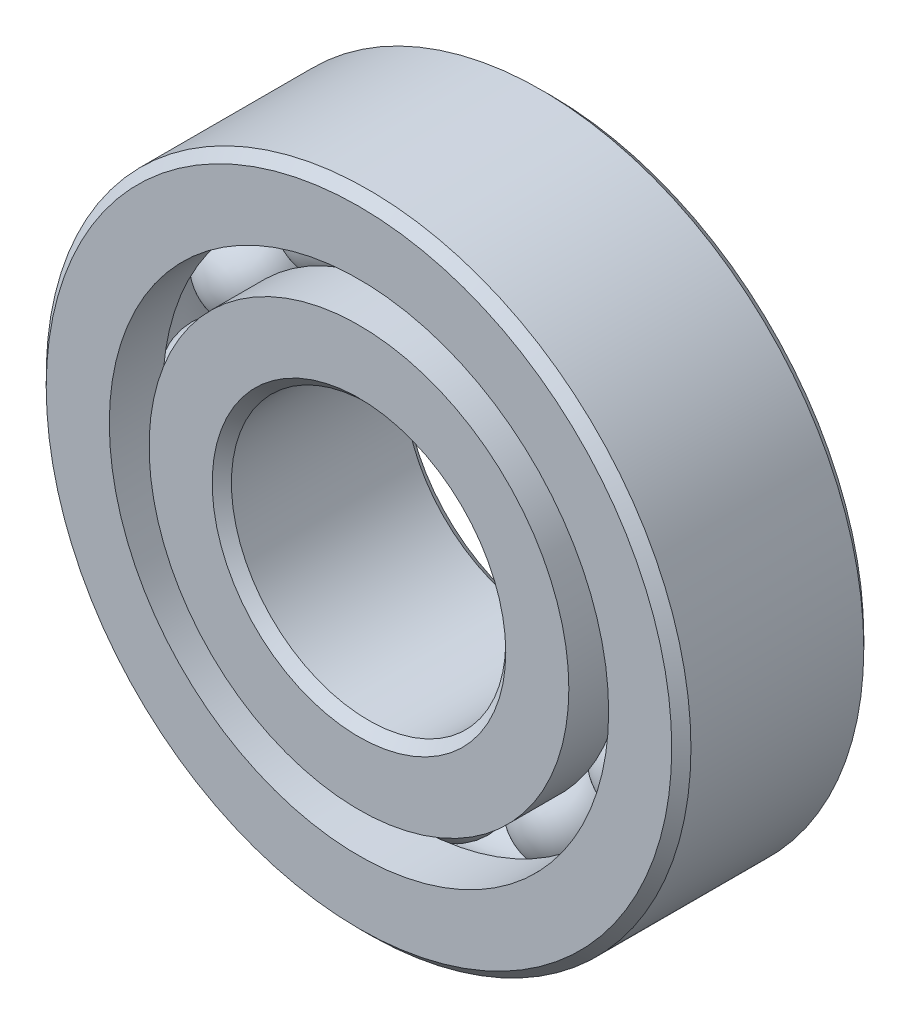
ISO-10303-21;
HEADER;
FILE_DESCRIPTION(('STEP AP214'),'2;1');
FILE_NAME('part.step','',(''),(''),'','','');
FILE_SCHEMA(('AUTOMOTIVE_DESIGN { 1 0 10303 214 1 1 1 1 }'));
ENDSEC;
DATA;
#1=APPLICATION_CONTEXT('core data for automotive mechanical design processes');
#2=APPLICATION_PROTOCOL_DEFINITION('international standard','automotive_design',2000,#1);
#3=PRODUCT_CONTEXT('',#1,'mechanical');
#4=PRODUCT('Part','Part','',(#3));
#5=PRODUCT_RELATED_PRODUCT_CATEGORY('part','',(#4));
#6=PRODUCT_DEFINITION_FORMATION('','',#4);
#7=PRODUCT_DEFINITION_CONTEXT('part definition',#1,'design');
#8=PRODUCT_DEFINITION('design','',#6,#7);
#9=PRODUCT_DEFINITION_SHAPE('','',#8);
#10=(LENGTH_UNIT() NAMED_UNIT(*) SI_UNIT(.MILLI.,.METRE.));
#11=(NAMED_UNIT(*) PLANE_ANGLE_UNIT() SI_UNIT($,.RADIAN.));
#12=(NAMED_UNIT(*) SI_UNIT($,.STERADIAN.) SOLID_ANGLE_UNIT());
#13=UNCERTAINTY_MEASURE_WITH_UNIT(LENGTH_MEASURE(1.E-05),#10,'distance_accuracy_value','');
#14=(GEOMETRIC_REPRESENTATION_CONTEXT(3) GLOBAL_UNCERTAINTY_ASSIGNED_CONTEXT((#13)) GLOBAL_UNIT_ASSIGNED_CONTEXT((#10,
#11,#12)) REPRESENTATION_CONTEXT('',''));
#15=CARTESIAN_POINT('',(0.,0.,0.));
#16=DIRECTION('',(0.,0.,1.));
#17=DIRECTION('',(1.,0.,0.));
#18=AXIS2_PLACEMENT_3D('',#15,#16,#17);
#19=CARTESIAN_POINT('',(-8.37499999999982,14.5059255133895,0.));
#20=DIRECTION('',(0.,0.,1.));
#21=DIRECTION('',(-0.499999999999989,0.866025403784445,0.));
#22=AXIS2_PLACEMENT_3D('',#19,#20,#21);
#23=SPHERICAL_SURFACE('',#22,3.43265291781274);
#24=CARTESIAN_POINT('',(-8.37499999999982,14.5059255133895,3.43265291781274));
#25=VERTEX_POINT('',#24);
#26=VERTEX_LOOP('',#25);
#27=FACE_BOUND('',#26,.T.);
#28=ADVANCED_FACE('F38',(#27),#23,.T.);
#29=CLOSED_SHELL('',(#28));
#30=MANIFOLD_SOLID_BREP('B2',#29);
#31=CARTESIAN_POINT('',(-14.5059255133893,8.37500000000017,0.));
#32=DIRECTION('',(0.,0.,1.));
#33=DIRECTION('',(-0.866025403784433,0.50000000000001,0.));
#34=AXIS2_PLACEMENT_3D('',#31,#32,#33);
#35=SPHERICAL_SURFACE('',#34,3.43265291781274);
#36=CARTESIAN_POINT('',(-14.5059255133893,8.37500000000017,3.43265291781274));
#37=VERTEX_POINT('',#36);
#38=VERTEX_LOOP('',#37);
#39=FACE_BOUND('',#38,.T.);
#40=ADVANCED_FACE('F69',(#39),#35,.T.);
#41=CLOSED_SHELL('',(#40));
#42=MANIFOLD_SOLID_BREP('B6',#41);
#43=CARTESIAN_POINT('',(-16.75,1.75446937276867E-13,0.));
#44=DIRECTION('',(0.,0.,1.));
#45=DIRECTION('',(-1.,0.,0.));
#46=AXIS2_PLACEMENT_3D('',#43,#44,#45);
#47=SPHERICAL_SURFACE('',#46,3.43265291781274);
#48=CARTESIAN_POINT('',(-16.75,1.75446937276867E-13,3.43265291781274));
#49=VERTEX_POINT('',#48);
#50=VERTEX_LOOP('',#49);
#51=FACE_BOUND('',#50,.T.);
#52=ADVANCED_FACE('F90',(#51),#47,.T.);
#53=CLOSED_SHELL('',(#52));
#54=MANIFOLD_SOLID_BREP('B34',#53);
#55=CARTESIAN_POINT('',(-14.5059255133894,-8.37499999999986,0.));
#56=DIRECTION('',(0.,0.,1.));
#57=DIRECTION('',(-0.866025403784443,-0.499999999999992,0.));
#58=AXIS2_PLACEMENT_3D('',#55,#56,#57);
#59=SPHERICAL_SURFACE('',#58,3.43265291781274);
#60=CARTESIAN_POINT('',(-14.5059255133894,-8.37499999999986,3.43265291781274));
#61=VERTEX_POINT('',#60);
#62=VERTEX_LOOP('',#61);
#63=FACE_BOUND('',#62,.T.);
#64=ADVANCED_FACE('F111',(#63),#59,.T.);
#65=CLOSED_SHELL('',(#64));
#66=MANIFOLD_SOLID_BREP('B65',#65);
#67=CARTESIAN_POINT('',(-8.37500000000012,-14.5059255133893,0.));
#68=DIRECTION('',(0.,0.,1.));
#69=DIRECTION('',(-0.500000000000007,-0.866025403784435,0.));
#70=AXIS2_PLACEMENT_3D('',#67,#68,#69);
#71=SPHERICAL_SURFACE('',#70,3.43265291781274);
#72=CARTESIAN_POINT('',(-8.37500000000012,-14.5059255133893,3.43265291781274));
#73=VERTEX_POINT('',#72);
#74=VERTEX_LOOP('',#73);
#75=FACE_BOUND('',#74,.T.);
#76=ADVANCED_FACE('F132',(#75),#71,.T.);
#77=CLOSED_SHELL('',(#76));
#78=MANIFOLD_SOLID_BREP('B86',#77);
#79=CARTESIAN_POINT('',(-1.16964624851245E-13,-16.75,0.));
#80=DIRECTION('',(0.,0.,1.));
#81=DIRECTION('',(0.,-1.,0.));
#82=AXIS2_PLACEMENT_3D('',#79,#80,#81);
#83=SPHERICAL_SURFACE('',#82,3.43265291781274);
#84=CARTESIAN_POINT('',(-1.16964624851245E-13,-16.75,3.43265291781274));
#85=VERTEX_POINT('',#84);
#86=VERTEX_LOOP('',#85);
#87=FACE_BOUND('',#86,.T.);
#88=ADVANCED_FACE('F153',(#87),#83,.T.);
#89=CLOSED_SHELL('',(#88));
#90=MANIFOLD_SOLID_BREP('B107',#89);
#91=CARTESIAN_POINT('',(8.37499999999991,-14.5059255133894,0.));
#92=DIRECTION('',(0.,0.,1.));
#93=DIRECTION('',(0.499999999999995,-0.866025403784442,0.));
#94=AXIS2_PLACEMENT_3D('',#91,#92,#93);
#95=SPHERICAL_SURFACE('',#94,3.43265291781274);
#96=CARTESIAN_POINT('',(8.37499999999991,-14.5059255133894,3.43265291781274));
#97=VERTEX_POINT('',#96);
#98=VERTEX_LOOP('',#97);
#99=FACE_BOUND('',#98,.T.);
#100=ADVANCED_FACE('F174',(#99),#95,.T.);
#101=CLOSED_SHELL('',(#100));
#102=MANIFOLD_SOLID_BREP('B128',#101);
#103=CARTESIAN_POINT('',(14.5059255133893,-8.37500000000007,0.));
#104=DIRECTION('',(0.,0.,1.));
#105=DIRECTION('',(0.866025403784436,-0.500000000000004,0.));
#106=AXIS2_PLACEMENT_3D('',#103,#104,#105);
#107=SPHERICAL_SURFACE('',#106,3.43265291781274);
#108=CARTESIAN_POINT('',(14.5059255133893,-8.37500000000007,3.43265291781274));
#109=VERTEX_POINT('',#108);
#110=VERTEX_LOOP('',#109);
#111=FACE_BOUND('',#110,.T.);
#112=ADVANCED_FACE('F195',(#111),#107,.T.);
#113=CLOSED_SHELL('',(#112));
#114=MANIFOLD_SOLID_BREP('B149',#113);
#115=CARTESIAN_POINT('',(16.75,0.,0.));
#116=DIRECTION('',(0.,0.,1.));
#117=DIRECTION('',(1.,0.,0.));
#118=AXIS2_PLACEMENT_3D('',#115,#116,#117);
#119=SPHERICAL_SURFACE('',#118,3.43265291781274);
#120=CARTESIAN_POINT('',(16.75,0.,3.43265291781274));
#121=VERTEX_POINT('',#120);
#122=VERTEX_LOOP('',#121);
#123=FACE_BOUND('',#122,.T.);
#124=ADVANCED_FACE('F216',(#123),#119,.T.);
#125=CLOSED_SHELL('',(#124));
#126=MANIFOLD_SOLID_BREP('B170',#125);
#127=CARTESIAN_POINT('',(14.5059255133894,8.37499999999997,0.));
#128=DIRECTION('',(0.,0.,1.));
#129=DIRECTION('',(0.86602540378444,0.499999999999998,0.));
#130=AXIS2_PLACEMENT_3D('',#127,#128,#129);
#131=SPHERICAL_SURFACE('',#130,3.43265291781274);
#132=CARTESIAN_POINT('',(14.5059255133894,8.37499999999997,3.43265291781274));
#133=VERTEX_POINT('',#132);
#134=VERTEX_LOOP('',#133);
#135=FACE_BOUND('',#134,.T.);
#136=ADVANCED_FACE('F237',(#135),#131,.T.);
#137=CLOSED_SHELL('',(#136));
#138=MANIFOLD_SOLID_BREP('B191',#137);
#139=CARTESIAN_POINT('',(8.37500000000002,14.5059255133893,0.));
#140=DIRECTION('',(0.,0.,1.));
#141=DIRECTION('',(0.500000000000001,0.866025403784438,0.));
#142=AXIS2_PLACEMENT_3D('',#139,#140,#141);
#143=SPHERICAL_SURFACE('',#142,3.43265291781274);
#144=CARTESIAN_POINT('',(8.37500000000002,14.5059255133893,3.43265291781274));
#145=VERTEX_POINT('',#144);
#146=VERTEX_LOOP('',#145);
#147=FACE_BOUND('',#146,.T.);
#148=ADVANCED_FACE('F258',(#147),#143,.T.);
#149=CLOSED_SHELL('',(#148));
#150=MANIFOLD_SOLID_BREP('B212',#149);
#151=CARTESIAN_POINT('',(0.,16.75,0.));
#152=DIRECTION('',(0.,0.,1.));
#153=DIRECTION('',(0.,1.,0.));
#154=AXIS2_PLACEMENT_3D('',#151,#152,#153);
#155=SPHERICAL_SURFACE('',#154,3.43265291781274);
#156=CARTESIAN_POINT('',(0.,16.75,3.43265291781274));
#157=VERTEX_POINT('',#156);
#158=VERTEX_LOOP('',#157);
#159=FACE_BOUND('',#158,.T.);
#160=ADVANCED_FACE('F281',(#159),#155,.T.);
#161=CLOSED_SHELL('',(#160));
#162=MANIFOLD_SOLID_BREP('B233',#161);
#163=CARTESIAN_POINT('',(0.,15.2994505494506,7.));
#164=DIRECTION('',(0.,0.,-1.));
#165=DIRECTION('',(-1.,0.,0.));
#166=AXIS2_PLACEMENT_3D('',#163,#164,#165);
#167=PLANE('',#166);
#168=CARTESIAN_POINT('',(0.,0.,7.));
#169=DIRECTION('',(0.,0.,1.));
#170=DIRECTION('',(1.,0.,0.));
#171=AXIS2_PLACEMENT_3D('',#168,#169,#170);
#172=CIRCLE('',#171,10.7);
#173=CARTESIAN_POINT('',(10.7,0.,7.));
#174=VERTEX_POINT('',#173);
#175=EDGE_CURVE('E329',#174,#174,#172,.T.);
#176=ORIENTED_EDGE('',*,*,#175,.F.);
#177=EDGE_LOOP('',(#176));
#178=FACE_BOUND('',#177,.T.);
#179=CARTESIAN_POINT('',(0.,0.,7.));
#180=DIRECTION('',(0.,0.,1.));
#181=DIRECTION('',(1.,0.,0.));
#182=AXIS2_PLACEMENT_3D('',#179,#180,#181);
#183=CIRCLE('',#182,15.2994505494506);
#184=CARTESIAN_POINT('',(15.2994505494506,0.,7.));
#185=VERTEX_POINT('',#184);
#186=EDGE_CURVE('E280',#185,#185,#183,.T.);
#187=ORIENTED_EDGE('',*,*,#186,.T.);
#188=EDGE_LOOP('',(#187));
#189=FACE_BOUND('',#188,.T.);
#190=ADVANCED_FACE('F301',(#178,#189),#167,.F.);
#191=CARTESIAN_POINT('',(0.,0.,7.));
#192=DIRECTION('',(0.,0.,1.));
#193=DIRECTION('',(1.,0.,0.));
#194=AXIS2_PLACEMENT_3D('',#191,#192,#193);
#195=CYLINDRICAL_SURFACE('',#194,15.2994505494506);
#196=ORIENTED_EDGE('',*,*,#186,.F.);
#197=EDGE_LOOP('',(#196));
#198=FACE_BOUND('',#197,.T.);
#199=CARTESIAN_POINT('',(0.,0.,3.11111111111111));
#200=DIRECTION('',(0.,0.,1.));
#201=DIRECTION('',(1.,0.,0.));
#202=AXIS2_PLACEMENT_3D('',#199,#200,#201);
#203=CIRCLE('',#202,15.2994505494506);
#204=CARTESIAN_POINT('',(15.2994505494506,0.,3.11111111111111));
#205=VERTEX_POINT('',#204);
#206=EDGE_CURVE('E307',#205,#205,#203,.T.);
#207=ORIENTED_EDGE('',*,*,#206,.T.);
#208=EDGE_LOOP('',(#207));
#209=FACE_BOUND('',#208,.T.);
#210=ADVANCED_FACE('F336',(#198,#209),#195,.T.);
#211=CARTESIAN_POINT('',(0.,0.,0.));
#212=DIRECTION('',(0.,0.,1.));
#213=DIRECTION('',(1.,0.,0.));
#214=AXIS2_PLACEMENT_3D('',#211,#212,#213);
#215=TOROIDAL_SURFACE('',#214,16.75,3.43265291781274);
#216=ORIENTED_EDGE('',*,*,#206,.F.);
#217=EDGE_LOOP('',(#216));
#218=FACE_BOUND('',#217,.T.);
#219=CARTESIAN_POINT('',(0.,0.,-3.11111111111112));
#220=DIRECTION('',(0.,0.,1.));
#221=DIRECTION('',(1.,0.,0.));
#222=AXIS2_PLACEMENT_3D('',#219,#220,#221);
#223=CIRCLE('',#222,15.2994505494505);
#224=CARTESIAN_POINT('',(15.2994505494505,0.,-3.11111111111112));
#225=VERTEX_POINT('',#224);
#226=EDGE_CURVE('E311',#225,#225,#223,.T.);
#227=ORIENTED_EDGE('',*,*,#226,.T.);
#228=EDGE_LOOP('',(#227));
#229=FACE_BOUND('',#228,.T.);
#230=ADVANCED_FACE('F340',(#218,#229),#215,.F.);
#231=CARTESIAN_POINT('',(0.,0.,7.));
#232=DIRECTION('',(0.,0.,1.));
#233=DIRECTION('',(1.,0.,0.));
#234=AXIS2_PLACEMENT_3D('',#231,#232,#233);
#235=CYLINDRICAL_SURFACE('',#234,15.2994505494506);
#236=ORIENTED_EDGE('',*,*,#226,.F.);
#237=EDGE_LOOP('',(#236));
#238=FACE_BOUND('',#237,.T.);
#239=CARTESIAN_POINT('',(0.,0.,-7.));
#240=DIRECTION('',(0.,0.,1.));
#241=DIRECTION('',(1.,0.,0.));
#242=AXIS2_PLACEMENT_3D('',#239,#240,#241);
#243=CIRCLE('',#242,15.2994505494506);
#244=CARTESIAN_POINT('',(15.2994505494506,0.,-7.));
#245=VERTEX_POINT('',#244);
#246=EDGE_CURVE('E315',#245,#245,#243,.T.);
#247=ORIENTED_EDGE('',*,*,#246,.T.);
#248=EDGE_LOOP('',(#247));
#249=FACE_BOUND('',#248,.T.);
#250=ADVANCED_FACE('F345',(#238,#249),#235,.T.);
#251=CARTESIAN_POINT('',(0.,10.7,-7.));
#252=DIRECTION('',(0.,0.,1.));
#253=DIRECTION('',(1.,0.,0.));
#254=AXIS2_PLACEMENT_3D('',#251,#252,#253);
#255=PLANE('',#254);
#256=ORIENTED_EDGE('',*,*,#246,.F.);
#257=EDGE_LOOP('',(#256));
#258=FACE_BOUND('',#257,.T.);
#259=CARTESIAN_POINT('',(0.,0.,-7.));
#260=DIRECTION('',(0.,0.,1.));
#261=DIRECTION('',(1.,0.,0.));
#262=AXIS2_PLACEMENT_3D('',#259,#260,#261);
#263=CIRCLE('',#262,10.7);
#264=CARTESIAN_POINT('',(10.7,0.,-7.));
#265=VERTEX_POINT('',#264);
#266=EDGE_CURVE('E320',#265,#265,#263,.T.);
#267=ORIENTED_EDGE('',*,*,#266,.T.);
#268=EDGE_LOOP('',(#267));
#269=FACE_BOUND('',#268,.T.);
#270=ADVANCED_FACE('F351',(#258,#269),#255,.F.);
#271=CARTESIAN_POINT('',(0.,0.,-6.3));
#272=DIRECTION('',(0.,0.,-1.));
#273=DIRECTION('',(-1.,0.,0.));
#274=AXIS2_PLACEMENT_3D('',#271,#272,#273);
#275=CONICAL_SURFACE('',#274,10.,0.78539816339745);
#276=ORIENTED_EDGE('',*,*,#266,.F.);
#277=EDGE_LOOP('',(#276));
#278=FACE_BOUND('',#277,.T.);
#279=CARTESIAN_POINT('',(0.,0.,-6.3));
#280=DIRECTION('',(0.,0.,1.));
#281=DIRECTION('',(1.,0.,0.));
#282=AXIS2_PLACEMENT_3D('',#279,#280,#281);
#283=CIRCLE('',#282,10.);
#284=CARTESIAN_POINT('',(10.,0.,-6.3));
#285=VERTEX_POINT('',#284);
#286=EDGE_CURVE('E323',#285,#285,#283,.T.);
#287=ORIENTED_EDGE('',*,*,#286,.T.);
#288=EDGE_LOOP('',(#287));
#289=FACE_BOUND('',#288,.T.);
#290=ADVANCED_FACE('F355',(#278,#289),#275,.F.);
#291=CARTESIAN_POINT('',(0.,0.,7.));
#292=DIRECTION('',(0.,0.,1.));
#293=DIRECTION('',(1.,0.,0.));
#294=AXIS2_PLACEMENT_3D('',#291,#292,#293);
#295=CYLINDRICAL_SURFACE('',#294,10.);
#296=ORIENTED_EDGE('',*,*,#286,.F.);
#297=EDGE_LOOP('',(#296));
#298=FACE_BOUND('',#297,.T.);
#299=CARTESIAN_POINT('',(0.,0.,6.3));
#300=DIRECTION('',(0.,0.,1.));
#301=DIRECTION('',(1.,0.,0.));
#302=AXIS2_PLACEMENT_3D('',#299,#300,#301);
#303=CIRCLE('',#302,10.);
#304=CARTESIAN_POINT('',(10.,0.,6.3));
#305=VERTEX_POINT('',#304);
#306=EDGE_CURVE('E326',#305,#305,#303,.T.);
#307=ORIENTED_EDGE('',*,*,#306,.T.);
#308=EDGE_LOOP('',(#307));
#309=FACE_BOUND('',#308,.T.);
#310=ADVANCED_FACE('F359',(#298,#309),#295,.F.);
#311=CARTESIAN_POINT('',(0.,0.,7.));
#312=DIRECTION('',(0.,0.,1.));
#313=DIRECTION('',(1.,0.,0.));
#314=AXIS2_PLACEMENT_3D('',#311,#312,#313);
#315=CONICAL_SURFACE('',#314,10.7,0.785398163397447);
#316=ORIENTED_EDGE('',*,*,#306,.F.);
#317=EDGE_LOOP('',(#316));
#318=FACE_BOUND('',#317,.T.);
#319=ORIENTED_EDGE('',*,*,#175,.T.);
#320=EDGE_LOOP('',(#319));
#321=FACE_BOUND('',#320,.T.);
#322=ADVANCED_FACE('F333',(#318,#321),#315,.F.);
#323=CLOSED_SHELL('',(#190,#210,#230,#250,#270,#290,#310,#322));
#324=MANIFOLD_SOLID_BREP('B254',#323);
#325=CARTESIAN_POINT('',(0.,0.,6.3));
#326=DIRECTION('',(0.,0.,-1.));
#327=DIRECTION('',(-1.,0.,0.));
#328=AXIS2_PLACEMENT_3D('',#325,#326,#327);
#329=CONICAL_SURFACE('',#328,23.5,0.785398163397448);
#330=CARTESIAN_POINT('',(0.,0.,7.));
#331=DIRECTION('',(0.,0.,1.));
#332=DIRECTION('',(1.,0.,0.));
#333=AXIS2_PLACEMENT_3D('',#330,#331,#332);
#334=CIRCLE('',#333,22.8);
#335=CARTESIAN_POINT('',(22.8,0.,7.));
#336=VERTEX_POINT('',#335);
#337=EDGE_CURVE('E451',#336,#336,#334,.T.);
#338=ORIENTED_EDGE('',*,*,#337,.F.);
#339=EDGE_LOOP('',(#338));
#340=FACE_BOUND('',#339,.T.);
#341=CARTESIAN_POINT('',(0.,0.,6.3));
#342=DIRECTION('',(0.,0.,1.));
#343=DIRECTION('',(1.,0.,0.));
#344=AXIS2_PLACEMENT_3D('',#341,#342,#343);
#345=CIRCLE('',#344,23.5);
#346=CARTESIAN_POINT('',(23.5,0.,6.3));
#347=VERTEX_POINT('',#346);
#348=EDGE_CURVE('E300',#347,#347,#345,.T.);
#349=ORIENTED_EDGE('',*,*,#348,.T.);
#350=EDGE_LOOP('',(#349));
#351=FACE_BOUND('',#350,.T.);
#352=ADVANCED_FACE('F423',(#340,#351),#329,.T.);
#353=CARTESIAN_POINT('',(0.,0.,7.));
#354=DIRECTION('',(0.,0.,1.));
#355=DIRECTION('',(1.,0.,0.));
#356=AXIS2_PLACEMENT_3D('',#353,#354,#355);
#357=CYLINDRICAL_SURFACE('',#356,23.5);
#358=ORIENTED_EDGE('',*,*,#348,.F.);
#359=EDGE_LOOP('',(#358));
#360=FACE_BOUND('',#359,.T.);
#361=CARTESIAN_POINT('',(0.,0.,-6.3));
#362=DIRECTION('',(0.,0.,1.));
#363=DIRECTION('',(1.,0.,0.));
#364=AXIS2_PLACEMENT_3D('',#361,#362,#363);
#365=CIRCLE('',#364,23.5);
#366=CARTESIAN_POINT('',(23.5,0.,-6.3));
#367=VERTEX_POINT('',#366);
#368=EDGE_CURVE('E429',#367,#367,#365,.T.);
#369=ORIENTED_EDGE('',*,*,#368,.T.);
#370=EDGE_LOOP('',(#369));
#371=FACE_BOUND('',#370,.T.);
#372=ADVANCED_FACE('F458',(#360,#371),#357,.T.);
#373=CARTESIAN_POINT('',(0.,0.,-7.));
#374=DIRECTION('',(0.,0.,1.));
#375=DIRECTION('',(1.,0.,0.));
#376=AXIS2_PLACEMENT_3D('',#373,#374,#375);
#377=CONICAL_SURFACE('',#376,22.8,0.785398163397448);
#378=ORIENTED_EDGE('',*,*,#368,.F.);
#379=EDGE_LOOP('',(#378));
#380=FACE_BOUND('',#379,.T.);
#381=CARTESIAN_POINT('',(0.,0.,-7.));
#382=DIRECTION('',(0.,0.,1.));
#383=DIRECTION('',(1.,0.,0.));
#384=AXIS2_PLACEMENT_3D('',#381,#382,#383);
#385=CIRCLE('',#384,22.8);
#386=CARTESIAN_POINT('',(22.8,0.,-7.));
#387=VERTEX_POINT('',#386);
#388=EDGE_CURVE('E433',#387,#387,#385,.T.);
#389=ORIENTED_EDGE('',*,*,#388,.T.);
#390=EDGE_LOOP('',(#389));
#391=FACE_BOUND('',#390,.T.);
#392=ADVANCED_FACE('F462',(#380,#391),#377,.T.);
#393=CARTESIAN_POINT('',(0.,22.8,-7.));
#394=DIRECTION('',(0.,0.,1.));
#395=DIRECTION('',(1.,0.,0.));
#396=AXIS2_PLACEMENT_3D('',#393,#394,#395);
#397=PLANE('',#396);
#398=ORIENTED_EDGE('',*,*,#388,.F.);
#399=EDGE_LOOP('',(#398));
#400=FACE_BOUND('',#399,.T.);
#401=CARTESIAN_POINT('',(0.,0.,-7.));
#402=DIRECTION('',(0.,0.,1.));
#403=DIRECTION('',(1.,0.,0.));
#404=AXIS2_PLACEMENT_3D('',#401,#402,#403);
#405=CIRCLE('',#404,18.2005494505494);
#406=CARTESIAN_POINT('',(18.2005494505494,0.,-7.));
#407=VERTEX_POINT('',#406);
#408=EDGE_CURVE('E437',#407,#407,#405,.T.);
#409=ORIENTED_EDGE('',*,*,#408,.T.);
#410=EDGE_LOOP('',(#409));
#411=FACE_BOUND('',#410,.T.);
#412=ADVANCED_FACE('F467',(#400,#411),#397,.F.);
#413=CARTESIAN_POINT('',(0.,0.,7.));
#414=DIRECTION('',(0.,0.,1.));
#415=DIRECTION('',(1.,0.,0.));
#416=AXIS2_PLACEMENT_3D('',#413,#414,#415);
#417=CYLINDRICAL_SURFACE('',#416,18.2005494505494);
#418=ORIENTED_EDGE('',*,*,#408,.F.);
#419=EDGE_LOOP('',(#418));
#420=FACE_BOUND('',#419,.T.);
#421=CARTESIAN_POINT('',(0.,0.,-3.11111111111111));
#422=DIRECTION('',(0.,0.,1.));
#423=DIRECTION('',(1.,0.,0.));
#424=AXIS2_PLACEMENT_3D('',#421,#422,#423);
#425=CIRCLE('',#424,18.2005494505495);
#426=CARTESIAN_POINT('',(18.2005494505495,0.,-3.11111111111111));
#427=VERTEX_POINT('',#426);
#428=EDGE_CURVE('E442',#427,#427,#425,.T.);
#429=ORIENTED_EDGE('',*,*,#428,.T.);
#430=EDGE_LOOP('',(#429));
#431=FACE_BOUND('',#430,.T.);
#432=ADVANCED_FACE('F473',(#420,#431),#417,.F.);
#433=CARTESIAN_POINT('',(0.,0.,0.));
#434=DIRECTION('',(0.,0.,1.));
#435=DIRECTION('',(1.,0.,0.));
#436=AXIS2_PLACEMENT_3D('',#433,#434,#435);
#437=TOROIDAL_SURFACE('',#436,16.75,3.43265291781274);
#438=ORIENTED_EDGE('',*,*,#428,.F.);
#439=EDGE_LOOP('',(#438));
#440=FACE_BOUND('',#439,.T.);
#441=CARTESIAN_POINT('',(0.,0.,3.11111111111111));
#442=DIRECTION('',(0.,0.,1.));
#443=DIRECTION('',(1.,0.,0.));
#444=AXIS2_PLACEMENT_3D('',#441,#442,#443);
#445=CIRCLE('',#444,18.2005494505495);
#446=CARTESIAN_POINT('',(18.2005494505495,0.,3.11111111111111));
#447=VERTEX_POINT('',#446);
#448=EDGE_CURVE('E445',#447,#447,#445,.T.);
#449=ORIENTED_EDGE('',*,*,#448,.T.);
#450=EDGE_LOOP('',(#449));
#451=FACE_BOUND('',#450,.T.);
#452=ADVANCED_FACE('F477',(#440,#451),#437,.F.);
#453=CARTESIAN_POINT('',(0.,0.,7.));
#454=DIRECTION('',(0.,0.,1.));
#455=DIRECTION('',(1.,0.,0.));
#456=AXIS2_PLACEMENT_3D('',#453,#454,#455);
#457=CYLINDRICAL_SURFACE('',#456,18.2005494505494);
#458=ORIENTED_EDGE('',*,*,#448,.F.);
#459=EDGE_LOOP('',(#458));
#460=FACE_BOUND('',#459,.T.);
#461=CARTESIAN_POINT('',(0.,0.,7.));
#462=DIRECTION('',(0.,0.,1.));
#463=DIRECTION('',(1.,0.,0.));
#464=AXIS2_PLACEMENT_3D('',#461,#462,#463);
#465=CIRCLE('',#464,18.2005494505494);
#466=CARTESIAN_POINT('',(18.2005494505494,0.,7.));
#467=VERTEX_POINT('',#466);
#468=EDGE_CURVE('E448',#467,#467,#465,.T.);
#469=ORIENTED_EDGE('',*,*,#468,.T.);
#470=EDGE_LOOP('',(#469));
#471=FACE_BOUND('',#470,.T.);
#472=ADVANCED_FACE('F481',(#460,#471),#457,.F.);
#473=CARTESIAN_POINT('',(0.,22.8,7.));
#474=DIRECTION('',(0.,0.,-1.));
#475=DIRECTION('',(-1.,0.,0.));
#476=AXIS2_PLACEMENT_3D('',#473,#474,#475);
#477=PLANE('',#476);
#478=ORIENTED_EDGE('',*,*,#468,.F.);
#479=EDGE_LOOP('',(#478));
#480=FACE_BOUND('',#479,.T.);
#481=ORIENTED_EDGE('',*,*,#337,.T.);
#482=EDGE_LOOP('',(#481));
#483=FACE_BOUND('',#482,.T.);
#484=ADVANCED_FACE('F455',(#480,#483),#477,.F.);
#485=CLOSED_SHELL('',(#352,#372,#392,#412,#432,#452,#472,#484));
#486=MANIFOLD_SOLID_BREP('B275',#485);
#487=ADVANCED_BREP_SHAPE_REPRESENTATION('',(#18,#30,#42,#54,#66,#78,#90,#102,#114,#126,#138,
#150,#162,#324,#486),#14);
#488=SHAPE_DEFINITION_REPRESENTATION(#9,#487);
ENDSEC;
END-ISO-10303-21;
